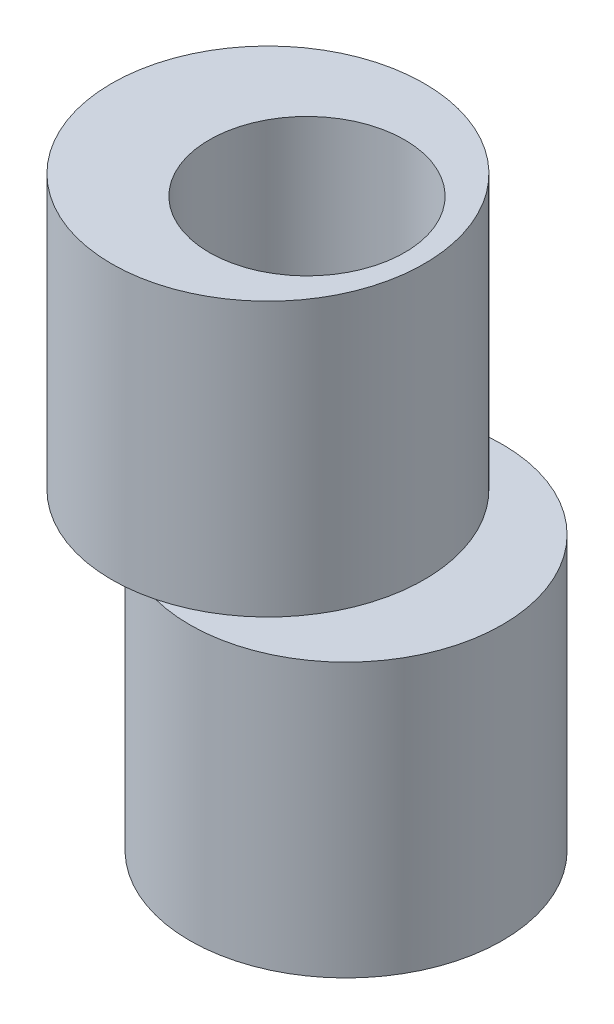
ISO-10303-21;
HEADER;
FILE_DESCRIPTION(('STEP AP214'),'2;1');
FILE_NAME('part.step','',(''),(''),'','','');
FILE_SCHEMA(('AUTOMOTIVE_DESIGN { 1 0 10303 214 1 1 1 1 }'));
ENDSEC;
DATA;
#1=APPLICATION_CONTEXT('core data for automotive mechanical design processes');
#2=APPLICATION_PROTOCOL_DEFINITION('international standard','automotive_design',2000,#1);
#3=PRODUCT_CONTEXT('',#1,'mechanical');
#4=PRODUCT('Part','Part','',(#3));
#5=PRODUCT_RELATED_PRODUCT_CATEGORY('part','',(#4));
#6=PRODUCT_DEFINITION_FORMATION('','',#4);
#7=PRODUCT_DEFINITION_CONTEXT('part definition',#1,'design');
#8=PRODUCT_DEFINITION('design','',#6,#7);
#9=PRODUCT_DEFINITION_SHAPE('','',#8);
#10=(LENGTH_UNIT() NAMED_UNIT(*) SI_UNIT(.MILLI.,.METRE.));
#11=(NAMED_UNIT(*) PLANE_ANGLE_UNIT() SI_UNIT($,.RADIAN.));
#12=(NAMED_UNIT(*) SI_UNIT($,.STERADIAN.) SOLID_ANGLE_UNIT());
#13=UNCERTAINTY_MEASURE_WITH_UNIT(LENGTH_MEASURE(1.E-05),#10,'distance_accuracy_value','');
#14=(GEOMETRIC_REPRESENTATION_CONTEXT(3) GLOBAL_UNCERTAINTY_ASSIGNED_CONTEXT((#13)) GLOBAL_UNIT_ASSIGNED_CONTEXT((#10,
#11,#12)) REPRESENTATION_CONTEXT('',''));
#15=CARTESIAN_POINT('',(0.,0.,0.));
#16=DIRECTION('',(0.,0.,1.));
#17=DIRECTION('',(1.,0.,0.));
#18=AXIS2_PLACEMENT_3D('',#15,#16,#17);
#19=CARTESIAN_POINT('',(1.,7.,0.));
#20=DIRECTION('',(0.,1.,0.));
#21=DIRECTION('',(0.,0.,1.));
#22=AXIS2_PLACEMENT_3D('',#19,#20,#21);
#23=PLANE('',#22);
#24=CARTESIAN_POINT('',(-1.,7.,0.));
#25=DIRECTION('',(0.,1.,0.));
#26=DIRECTION('',(0.,0.,1.));
#27=AXIS2_PLACEMENT_3D('',#24,#25,#26);
#28=CIRCLE('',#27,4.);
#29=CARTESIAN_POINT('',(0.,7.,3.87298334620742));
#30=VERTEX_POINT('',#29);
#31=CARTESIAN_POINT('',(0.,7.,-3.87298334620742));
#32=VERTEX_POINT('',#31);
#33=EDGE_CURVE('E48',#30,#32,#28,.T.);
#34=ORIENTED_EDGE('',*,*,#33,.F.);
#35=CARTESIAN_POINT('',(1.,7.,0.));
#36=DIRECTION('',(0.,1.,0.));
#37=DIRECTION('',(0.,0.,1.));
#38=AXIS2_PLACEMENT_3D('',#35,#36,#37);
#39=CIRCLE('',#38,4.);
#40=EDGE_CURVE('E42',#30,#32,#39,.T.);
#41=ORIENTED_EDGE('',*,*,#40,.T.);
#42=EDGE_LOOP('',(#34,#41));
#43=FACE_BOUND('',#42,.T.);
#44=ADVANCED_FACE('F33',(#43),#23,.T.);
#45=CARTESIAN_POINT('',(1.,0.,0.));
#46=DIRECTION('',(0.,1.,0.));
#47=DIRECTION('',(0.,0.,1.));
#48=AXIS2_PLACEMENT_3D('',#45,#46,#47);
#49=PLANE('',#48);
#50=CARTESIAN_POINT('',(1.,0.,0.));
#51=DIRECTION('',(0.,1.,0.));
#52=DIRECTION('',(0.,0.,1.));
#53=AXIS2_PLACEMENT_3D('',#50,#51,#52);
#54=CIRCLE('',#53,4.);
#55=CARTESIAN_POINT('',(1.,0.,4.));
#56=VERTEX_POINT('',#55);
#57=EDGE_CURVE('E37',#56,#56,#54,.T.);
#58=ORIENTED_EDGE('',*,*,#57,.F.);
#59=EDGE_LOOP('',(#58));
#60=FACE_BOUND('',#59,.T.);
#61=CARTESIAN_POINT('',(0.,0.,0.));
#62=DIRECTION('',(0.,1.,0.));
#63=DIRECTION('',(0.,0.,1.));
#64=AXIS2_PLACEMENT_3D('',#61,#62,#63);
#65=CIRCLE('',#64,2.5);
#66=CARTESIAN_POINT('',(0.,0.,2.5));
#67=VERTEX_POINT('',#66);
#68=EDGE_CURVE('E64',#67,#67,#65,.T.);
#69=ORIENTED_EDGE('',*,*,#68,.T.);
#70=EDGE_LOOP('',(#69));
#71=FACE_BOUND('',#70,.T.);
#72=ADVANCED_FACE('F74',(#60,#71),#49,.F.);
#73=CARTESIAN_POINT('',(1.,7.,0.));
#74=DIRECTION('',(0.,-1.,0.));
#75=DIRECTION('',(0.,0.,-1.));
#76=AXIS2_PLACEMENT_3D('',#73,#74,#75);
#77=CYLINDRICAL_SURFACE('',#76,4.);
#78=EDGE_CURVE('E11',#32,#30,#39,.T.);
#79=ORIENTED_EDGE('',*,*,#78,.F.);
#80=ORIENTED_EDGE('',*,*,#40,.F.);
#81=EDGE_LOOP('',(#79,#80));
#82=FACE_BOUND('',#81,.T.);
#83=ORIENTED_EDGE('',*,*,#57,.T.);
#84=EDGE_LOOP('',(#83));
#85=FACE_BOUND('',#84,.T.);
#86=ADVANCED_FACE('F35',(#82,#85),#77,.T.);
#87=CARTESIAN_POINT('',(0.,7.,0.));
#88=DIRECTION('',(0.,-1.,0.));
#89=DIRECTION('',(0.,0.,-1.));
#90=AXIS2_PLACEMENT_3D('',#87,#88,#89);
#91=CYLINDRICAL_SURFACE('',#90,2.5);
#92=ORIENTED_EDGE('',*,*,#68,.F.);
#93=EDGE_LOOP('',(#92));
#94=FACE_BOUND('',#93,.T.);
#95=CARTESIAN_POINT('',(0.,14.,0.));
#96=DIRECTION('',(0.,1.,0.));
#97=DIRECTION('',(0.,0.,1.));
#98=AXIS2_PLACEMENT_3D('',#95,#96,#97);
#99=CIRCLE('',#98,2.5);
#100=CARTESIAN_POINT('',(0.,14.,2.5));
#101=VERTEX_POINT('',#100);
#102=EDGE_CURVE('E59',#101,#101,#99,.T.);
#103=ORIENTED_EDGE('',*,*,#102,.T.);
#104=EDGE_LOOP('',(#103));
#105=FACE_BOUND('',#104,.T.);
#106=ADVANCED_FACE('F80',(#94,#105),#91,.F.);
#107=CARTESIAN_POINT('',(-1.,7.,0.));
#108=DIRECTION('',(0.,1.,0.));
#109=DIRECTION('',(0.,0.,1.));
#110=AXIS2_PLACEMENT_3D('',#107,#108,#109);
#111=PLANE('',#110);
#112=EDGE_CURVE('E56',#32,#30,#28,.T.);
#113=ORIENTED_EDGE('',*,*,#112,.F.);
#114=ORIENTED_EDGE('',*,*,#78,.T.);
#115=EDGE_LOOP('',(#113,#114));
#116=FACE_BOUND('',#115,.T.);
#117=ADVANCED_FACE('F57',(#116),#111,.F.);
#118=CARTESIAN_POINT('',(-1.,14.,0.));
#119=DIRECTION('',(0.,1.,0.));
#120=DIRECTION('',(0.,0.,1.));
#121=AXIS2_PLACEMENT_3D('',#118,#119,#120);
#122=PLANE('',#121);
#123=CARTESIAN_POINT('',(-1.,14.,0.));
#124=DIRECTION('',(0.,1.,0.));
#125=DIRECTION('',(0.,0.,1.));
#126=AXIS2_PLACEMENT_3D('',#123,#124,#125);
#127=CIRCLE('',#126,4.);
#128=CARTESIAN_POINT('',(-1.,14.,4.));
#129=VERTEX_POINT('',#128);
#130=EDGE_CURVE('E62',#129,#129,#127,.T.);
#131=ORIENTED_EDGE('',*,*,#130,.T.);
#132=EDGE_LOOP('',(#131));
#133=FACE_BOUND('',#132,.T.);
#134=ORIENTED_EDGE('',*,*,#102,.F.);
#135=EDGE_LOOP('',(#134));
#136=FACE_BOUND('',#135,.T.);
#137=ADVANCED_FACE('F88',(#133,#136),#122,.T.);
#138=CARTESIAN_POINT('',(-1.,14.,0.));
#139=DIRECTION('',(0.,-1.,0.));
#140=DIRECTION('',(0.,0.,-1.));
#141=AXIS2_PLACEMENT_3D('',#138,#139,#140);
#142=CYLINDRICAL_SURFACE('',#141,4.);
#143=ORIENTED_EDGE('',*,*,#130,.F.);
#144=EDGE_LOOP('',(#143));
#145=FACE_BOUND('',#144,.T.);
#146=ORIENTED_EDGE('',*,*,#33,.T.);
#147=ORIENTED_EDGE('',*,*,#112,.T.);
#148=EDGE_LOOP('',(#146,#147));
#149=FACE_BOUND('',#148,.T.);
#150=ADVANCED_FACE('F61',(#145,#149),#142,.T.);
#151=CLOSED_SHELL('',(#44,#72,#86,#106,#117,#137,#150));
#152=MANIFOLD_SOLID_BREP('B2',#151);
#153=ADVANCED_BREP_SHAPE_REPRESENTATION('',(#18,#152),#14);
#154=SHAPE_DEFINITION_REPRESENTATION(#9,#153);
ENDSEC;
END-ISO-10303-21;
